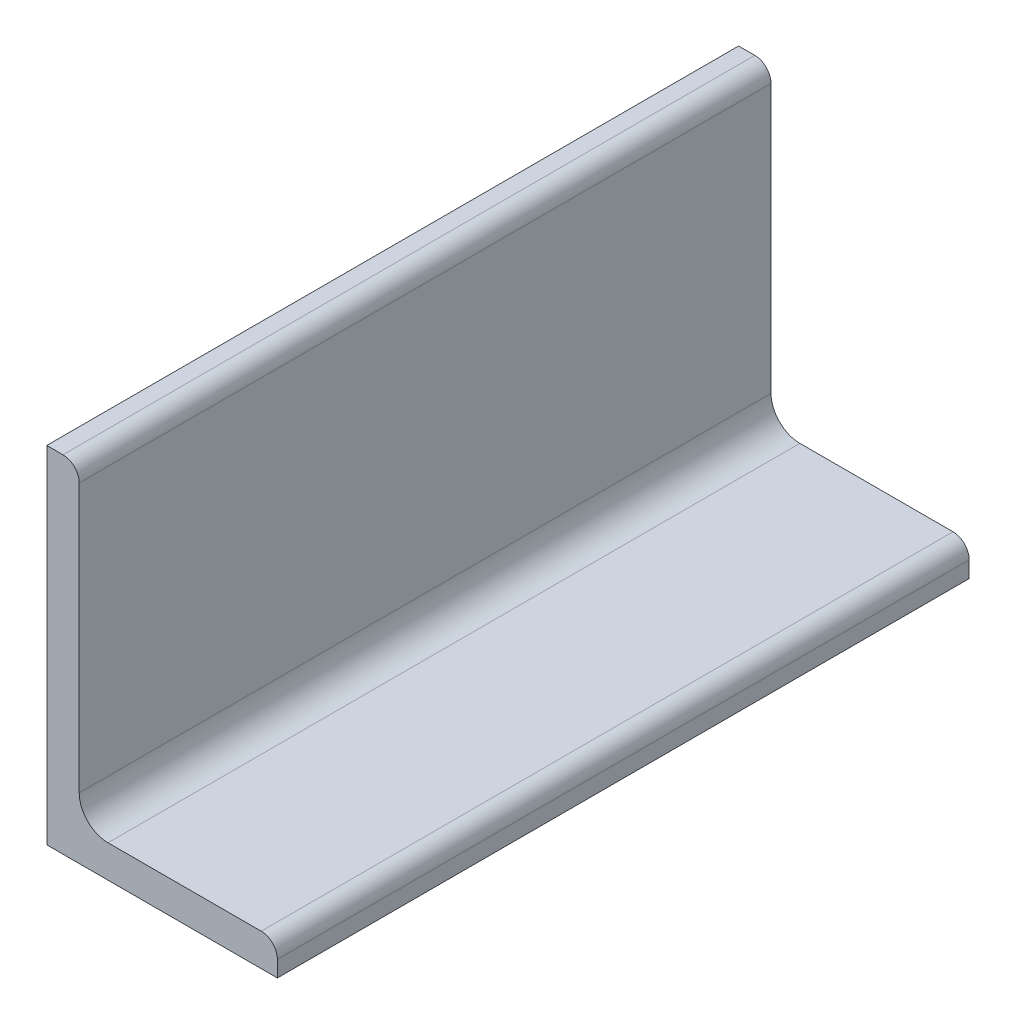
ISO-10303-21;
HEADER;
FILE_DESCRIPTION(('STEP AP214'),'2;1');
FILE_NAME('part.step','',(''),(''),'','','');
FILE_SCHEMA(('AUTOMOTIVE_DESIGN { 1 0 10303 214 1 1 1 1 }'));
ENDSEC;
DATA;
#1=APPLICATION_CONTEXT('core data for automotive mechanical design processes');
#2=APPLICATION_PROTOCOL_DEFINITION('international standard','automotive_design',2000,#1);
#3=PRODUCT_CONTEXT('',#1,'mechanical');
#4=PRODUCT('Part','Part','',(#3));
#5=PRODUCT_RELATED_PRODUCT_CATEGORY('part','',(#4));
#6=PRODUCT_DEFINITION_FORMATION('','',#4);
#7=PRODUCT_DEFINITION_CONTEXT('part definition',#1,'design');
#8=PRODUCT_DEFINITION('design','',#6,#7);
#9=PRODUCT_DEFINITION_SHAPE('','',#8);
#10=(LENGTH_UNIT() NAMED_UNIT(*) SI_UNIT(.MILLI.,.METRE.));
#11=(NAMED_UNIT(*) PLANE_ANGLE_UNIT() SI_UNIT($,.RADIAN.));
#12=(NAMED_UNIT(*) SI_UNIT($,.STERADIAN.) SOLID_ANGLE_UNIT());
#13=UNCERTAINTY_MEASURE_WITH_UNIT(LENGTH_MEASURE(1.E-05),#10,'distance_accuracy_value','');
#14=(GEOMETRIC_REPRESENTATION_CONTEXT(3) GLOBAL_UNCERTAINTY_ASSIGNED_CONTEXT((#13)) GLOBAL_UNIT_ASSIGNED_CONTEXT((#10,
#11,#12)) REPRESENTATION_CONTEXT('',''));
#15=CARTESIAN_POINT('',(0.,0.,0.));
#16=DIRECTION('',(0.,0.,1.));
#17=DIRECTION('',(1.,0.,0.));
#18=AXIS2_PLACEMENT_3D('',#15,#16,#17);
#19=CARTESIAN_POINT('',(0.865045893659089,152.925428131371,304.8));
#20=DIRECTION('',(1.,0.,0.));
#21=DIRECTION('',(0.,0.,-1.));
#22=AXIS2_PLACEMENT_3D('',#19,#20,#21);
#23=PLANE('',#22);
#24=DIRECTION('',(0.,-1.,0.));
#25=VECTOR('',#24,1.);
#26=CARTESIAN_POINT('',(0.865045893659089,152.925428131371,0.));
#27=LINE('',#26,#25);
#28=CARTESIAN_POINT('',(0.865045893659089,152.925428131371,0.));
#29=VERTEX_POINT('',#28);
#30=CARTESIAN_POINT('',(0.865045893659089,0.525428131371291,0.));
#31=VERTEX_POINT('',#30);
#32=EDGE_CURVE('E135',#29,#31,#27,.T.);
#33=ORIENTED_EDGE('',*,*,#32,.T.);
#34=DIRECTION('',(0.,0.,-1.));
#35=VECTOR('',#34,1.);
#36=CARTESIAN_POINT('',(0.865045893659089,0.525428131371291,304.8));
#37=LINE('',#36,#35);
#38=CARTESIAN_POINT('',(0.865045893659089,0.525428131371291,304.8));
#39=VERTEX_POINT('',#38);
#40=EDGE_CURVE('E11',#39,#31,#37,.T.);
#41=ORIENTED_EDGE('',*,*,#40,.F.);
#42=DIRECTION('',(0.,-1.,0.));
#43=VECTOR('',#42,1.);
#44=CARTESIAN_POINT('',(0.865045893659089,152.925428131371,304.8));
#45=LINE('',#44,#43);
#46=CARTESIAN_POINT('',(0.865045893659089,152.925428131371,304.8));
#47=VERTEX_POINT('',#46);
#48=EDGE_CURVE('E151',#47,#39,#45,.T.);
#49=ORIENTED_EDGE('',*,*,#48,.F.);
#50=DIRECTION('',(0.,0.,-1.));
#51=VECTOR('',#50,1.);
#52=CARTESIAN_POINT('',(0.865045893659089,152.925428131371,304.8));
#53=LINE('',#52,#51);
#54=EDGE_CURVE('E131',#47,#29,#53,.T.);
#55=ORIENTED_EDGE('',*,*,#54,.T.);
#56=EDGE_LOOP('',(#33,#41,#49,#55));
#57=FACE_BOUND('',#56,.T.);
#58=ADVANCED_FACE('F33',(#57),#23,.F.);
#59=CARTESIAN_POINT('',(0.865045893659089,0.525428131371291,304.8));
#60=DIRECTION('',(0.,1.,0.));
#61=DIRECTION('',(0.,0.,1.));
#62=AXIS2_PLACEMENT_3D('',#59,#60,#61);
#63=PLANE('',#62);
#64=DIRECTION('',(1.,0.,0.));
#65=VECTOR('',#64,1.);
#66=CARTESIAN_POINT('',(0.865045893659089,0.525428131371291,0.));
#67=LINE('',#66,#65);
#68=CARTESIAN_POINT('',(102.465045893659,0.525428131371291,0.));
#69=VERTEX_POINT('',#68);
#70=EDGE_CURVE('E138',#31,#69,#67,.T.);
#71=ORIENTED_EDGE('',*,*,#70,.T.);
#72=DIRECTION('',(0.,0.,-1.));
#73=VECTOR('',#72,1.);
#74=CARTESIAN_POINT('',(102.465045893659,0.525428131371291,304.8));
#75=LINE('',#74,#73);
#76=CARTESIAN_POINT('',(102.465045893659,0.525428131371291,304.8));
#77=VERTEX_POINT('',#76);
#78=EDGE_CURVE('E41',#77,#69,#75,.T.);
#79=ORIENTED_EDGE('',*,*,#78,.F.);
#80=DIRECTION('',(1.,0.,0.));
#81=VECTOR('',#80,1.);
#82=CARTESIAN_POINT('',(0.865045893659089,0.525428131371291,304.8));
#83=LINE('',#82,#81);
#84=EDGE_CURVE('E95',#39,#77,#83,.T.);
#85=ORIENTED_EDGE('',*,*,#84,.F.);
#86=ORIENTED_EDGE('',*,*,#40,.T.);
#87=EDGE_LOOP('',(#71,#79,#85,#86));
#88=FACE_BOUND('',#87,.T.);
#89=ADVANCED_FACE('F194',(#88),#63,.F.);
#90=CARTESIAN_POINT('',(102.465045893659,0.525428131371291,304.8));
#91=DIRECTION('',(-1.,0.,0.));
#92=DIRECTION('',(0.,0.,1.));
#93=AXIS2_PLACEMENT_3D('',#90,#91,#92);
#94=PLANE('',#93);
#95=DIRECTION('',(0.,1.,0.));
#96=VECTOR('',#95,1.);
#97=CARTESIAN_POINT('',(102.465045893659,0.525428131371291,0.));
#98=LINE('',#97,#96);
#99=CARTESIAN_POINT('',(102.465045893659,7.66917813137129,0.));
#100=VERTEX_POINT('',#99);
#101=EDGE_CURVE('E140',#69,#100,#98,.T.);
#102=ORIENTED_EDGE('',*,*,#101,.T.);
#103=DIRECTION('',(0.,0.,-1.));
#104=VECTOR('',#103,1.);
#105=CARTESIAN_POINT('',(102.465045893659,7.66917813137129,304.8));
#106=LINE('',#105,#104);
#107=CARTESIAN_POINT('',(102.465045893659,7.66917813137129,304.8));
#108=VERTEX_POINT('',#107);
#109=EDGE_CURVE('E161',#108,#100,#106,.T.);
#110=ORIENTED_EDGE('',*,*,#109,.F.);
#111=DIRECTION('',(0.,1.,0.));
#112=VECTOR('',#111,1.);
#113=CARTESIAN_POINT('',(102.465045893659,0.525428131371291,304.8));
#114=LINE('',#113,#112);
#115=EDGE_CURVE('E169',#77,#108,#114,.T.);
#116=ORIENTED_EDGE('',*,*,#115,.F.);
#117=ORIENTED_EDGE('',*,*,#78,.T.);
#118=EDGE_LOOP('',(#102,#110,#116,#117));
#119=FACE_BOUND('',#118,.T.);
#120=ADVANCED_FACE('F167',(#119),#94,.F.);
#121=CARTESIAN_POINT('',(95.3212958936591,7.66917813137129,304.8));
#122=DIRECTION('',(0.,0.,-1.));
#123=DIRECTION('',(-1.,0.,0.));
#124=AXIS2_PLACEMENT_3D('',#121,#122,#123);
#125=CYLINDRICAL_SURFACE('',#124,7.14375000000001);
#126=CARTESIAN_POINT('',(95.3212958936591,7.66917813137129,0.));
#127=DIRECTION('',(0.,0.,1.));
#128=DIRECTION('',(1.,0.,0.));
#129=AXIS2_PLACEMENT_3D('',#126,#127,#128);
#130=CIRCLE('',#129,7.14375000000001);
#131=CARTESIAN_POINT('',(95.3212958936591,14.8129281313713,0.));
#132=VERTEX_POINT('',#131);
#133=EDGE_CURVE('E142',#100,#132,#130,.T.);
#134=ORIENTED_EDGE('',*,*,#133,.T.);
#135=DIRECTION('',(0.,0.,-1.));
#136=VECTOR('',#135,1.);
#137=CARTESIAN_POINT('',(95.3212958936591,14.8129281313713,304.8));
#138=LINE('',#137,#136);
#139=CARTESIAN_POINT('',(95.3212958936591,14.8129281313713,304.8));
#140=VERTEX_POINT('',#139);
#141=EDGE_CURVE('E158',#140,#132,#138,.T.);
#142=ORIENTED_EDGE('',*,*,#141,.F.);
#143=CARTESIAN_POINT('',(95.3212958936591,7.66917813137129,304.8));
#144=DIRECTION('',(0.,0.,1.));
#145=DIRECTION('',(1.,0.,0.));
#146=AXIS2_PLACEMENT_3D('',#143,#144,#145);
#147=CIRCLE('',#146,7.14375000000001);
#148=EDGE_CURVE('E185',#108,#140,#147,.T.);
#149=ORIENTED_EDGE('',*,*,#148,.F.);
#150=ORIENTED_EDGE('',*,*,#109,.T.);
#151=EDGE_LOOP('',(#134,#142,#149,#150));
#152=FACE_BOUND('',#151,.T.);
#153=ADVANCED_FACE('F178',(#152),#125,.T.);
#154=CARTESIAN_POINT('',(95.3212958936591,14.8129281313713,304.8));
#155=DIRECTION('',(0.,-1.,0.));
#156=DIRECTION('',(0.,0.,-1.));
#157=AXIS2_PLACEMENT_3D('',#154,#155,#156);
#158=PLANE('',#157);
#159=DIRECTION('',(-1.,0.,0.));
#160=VECTOR('',#159,1.);
#161=CARTESIAN_POINT('',(95.3212958936591,14.8129281313713,0.));
#162=LINE('',#161,#160);
#163=CARTESIAN_POINT('',(27.8525458936591,14.8129281313713,0.));
#164=VERTEX_POINT('',#163);
#165=EDGE_CURVE('E144',#132,#164,#162,.T.);
#166=ORIENTED_EDGE('',*,*,#165,.T.);
#167=DIRECTION('',(0.,0.,-1.));
#168=VECTOR('',#167,1.);
#169=CARTESIAN_POINT('',(27.8525458936591,14.8129281313713,304.8));
#170=LINE('',#169,#168);
#171=CARTESIAN_POINT('',(27.8525458936591,14.8129281313713,304.8));
#172=VERTEX_POINT('',#171);
#173=EDGE_CURVE('E155',#172,#164,#170,.T.);
#174=ORIENTED_EDGE('',*,*,#173,.F.);
#175=DIRECTION('',(-1.,0.,0.));
#176=VECTOR('',#175,1.);
#177=CARTESIAN_POINT('',(95.3212958936591,14.8129281313713,304.8));
#178=LINE('',#177,#176);
#179=EDGE_CURVE('E184',#140,#172,#178,.T.);
#180=ORIENTED_EDGE('',*,*,#179,.F.);
#181=ORIENTED_EDGE('',*,*,#141,.T.);
#182=EDGE_LOOP('',(#166,#174,#180,#181));
#183=FACE_BOUND('',#182,.T.);
#184=ADVANCED_FACE('F182',(#183),#158,.F.);
#185=CARTESIAN_POINT('',(27.8525458936591,27.5129281313713,304.8));
#186=DIRECTION('',(0.,0.,-1.));
#187=DIRECTION('',(-1.,0.,0.));
#188=AXIS2_PLACEMENT_3D('',#185,#186,#187);
#189=CYLINDRICAL_SURFACE('',#188,12.7);
#190=CARTESIAN_POINT('',(27.8525458936591,27.5129281313713,0.));
#191=DIRECTION('',(0.,0.,-1.));
#192=DIRECTION('',(1.,0.,0.));
#193=AXIS2_PLACEMENT_3D('',#190,#191,#192);
#194=CIRCLE('',#193,12.7);
#195=CARTESIAN_POINT('',(15.1525458936591,27.5129281313713,0.));
#196=VERTEX_POINT('',#195);
#197=EDGE_CURVE('E146',#164,#196,#194,.T.);
#198=ORIENTED_EDGE('',*,*,#197,.T.);
#199=DIRECTION('',(0.,0.,-1.));
#200=VECTOR('',#199,1.);
#201=CARTESIAN_POINT('',(15.1525458936591,27.5129281313713,304.8));
#202=LINE('',#201,#200);
#203=CARTESIAN_POINT('',(15.1525458936591,27.5129281313713,304.8));
#204=VERTEX_POINT('',#203);
#205=EDGE_CURVE('E126',#204,#196,#202,.T.);
#206=ORIENTED_EDGE('',*,*,#205,.F.);
#207=CARTESIAN_POINT('',(27.8525458936591,27.5129281313713,304.8));
#208=DIRECTION('',(0.,0.,-1.));
#209=DIRECTION('',(1.,0.,0.));
#210=AXIS2_PLACEMENT_3D('',#207,#208,#209);
#211=CIRCLE('',#210,12.7);
#212=EDGE_CURVE('E117',#172,#204,#211,.T.);
#213=ORIENTED_EDGE('',*,*,#212,.F.);
#214=ORIENTED_EDGE('',*,*,#173,.T.);
#215=EDGE_LOOP('',(#198,#206,#213,#214));
#216=FACE_BOUND('',#215,.T.);
#217=ADVANCED_FACE('F206',(#216),#189,.F.);
#218=CARTESIAN_POINT('',(15.1525458936591,27.5129281313713,304.8));
#219=DIRECTION('',(-1.,0.,0.));
#220=DIRECTION('',(0.,0.,1.));
#221=AXIS2_PLACEMENT_3D('',#218,#219,#220);
#222=PLANE('',#221);
#223=DIRECTION('',(0.,1.,0.));
#224=VECTOR('',#223,1.);
#225=CARTESIAN_POINT('',(15.1525458936591,27.5129281313713,0.));
#226=LINE('',#225,#224);
#227=CARTESIAN_POINT('',(15.1525458936591,145.781678131371,0.));
#228=VERTEX_POINT('',#227);
#229=EDGE_CURVE('E125',#196,#228,#226,.T.);
#230=ORIENTED_EDGE('',*,*,#229,.T.);
#231=DIRECTION('',(0.,0.,-1.));
#232=VECTOR('',#231,1.);
#233=CARTESIAN_POINT('',(15.1525458936591,145.781678131371,304.8));
#234=LINE('',#233,#232);
#235=CARTESIAN_POINT('',(15.1525458936591,145.781678131371,304.8));
#236=VERTEX_POINT('',#235);
#237=EDGE_CURVE('E122',#236,#228,#234,.T.);
#238=ORIENTED_EDGE('',*,*,#237,.F.);
#239=DIRECTION('',(0.,1.,0.));
#240=VECTOR('',#239,1.);
#241=CARTESIAN_POINT('',(15.1525458936591,27.5129281313713,304.8));
#242=LINE('',#241,#240);
#243=EDGE_CURVE('E111',#204,#236,#242,.T.);
#244=ORIENTED_EDGE('',*,*,#243,.F.);
#245=ORIENTED_EDGE('',*,*,#205,.T.);
#246=EDGE_LOOP('',(#230,#238,#244,#245));
#247=FACE_BOUND('',#246,.T.);
#248=ADVANCED_FACE('F123',(#247),#222,.F.);
#249=CARTESIAN_POINT('',(8.00879589365909,145.781678131371,304.8));
#250=DIRECTION('',(0.,0.,-1.));
#251=DIRECTION('',(-1.,0.,0.));
#252=AXIS2_PLACEMENT_3D('',#249,#250,#251);
#253=CYLINDRICAL_SURFACE('',#252,7.14375);
#254=CARTESIAN_POINT('',(8.00879589365909,145.781678131371,0.));
#255=DIRECTION('',(0.,0.,1.));
#256=DIRECTION('',(1.,0.,0.));
#257=AXIS2_PLACEMENT_3D('',#254,#255,#256);
#258=CIRCLE('',#257,7.14375);
#259=CARTESIAN_POINT('',(8.00879589365909,152.925428131371,0.));
#260=VERTEX_POINT('',#259);
#261=EDGE_CURVE('E81',#228,#260,#258,.T.);
#262=ORIENTED_EDGE('',*,*,#261,.T.);
#263=DIRECTION('',(0.,0.,-1.));
#264=VECTOR('',#263,1.);
#265=CARTESIAN_POINT('',(8.00879589365909,152.925428131371,304.8));
#266=LINE('',#265,#264);
#267=CARTESIAN_POINT('',(8.00879589365909,152.925428131371,304.8));
#268=VERTEX_POINT('',#267);
#269=EDGE_CURVE('E127',#268,#260,#266,.T.);
#270=ORIENTED_EDGE('',*,*,#269,.F.);
#271=CARTESIAN_POINT('',(8.00879589365909,145.781678131371,304.8));
#272=DIRECTION('',(0.,0.,1.));
#273=DIRECTION('',(1.,0.,0.));
#274=AXIS2_PLACEMENT_3D('',#271,#272,#273);
#275=CIRCLE('',#274,7.14375);
#276=EDGE_CURVE('E115',#236,#268,#275,.T.);
#277=ORIENTED_EDGE('',*,*,#276,.F.);
#278=ORIENTED_EDGE('',*,*,#237,.T.);
#279=EDGE_LOOP('',(#262,#270,#277,#278));
#280=FACE_BOUND('',#279,.T.);
#281=ADVANCED_FACE('F129',(#280),#253,.T.);
#282=CARTESIAN_POINT('',(8.00879589365909,152.925428131371,304.8));
#283=DIRECTION('',(0.,-1.,0.));
#284=DIRECTION('',(0.,0.,-1.));
#285=AXIS2_PLACEMENT_3D('',#282,#283,#284);
#286=PLANE('',#285);
#287=DIRECTION('',(-1.,0.,0.));
#288=VECTOR('',#287,1.);
#289=CARTESIAN_POINT('',(8.00879589365909,152.925428131371,0.));
#290=LINE('',#289,#288);
#291=EDGE_CURVE('E87',#260,#29,#290,.T.);
#292=ORIENTED_EDGE('',*,*,#291,.T.);
#293=ORIENTED_EDGE('',*,*,#54,.F.);
#294=DIRECTION('',(-1.,0.,0.));
#295=VECTOR('',#294,1.);
#296=CARTESIAN_POINT('',(8.00879589365909,152.925428131371,304.8));
#297=LINE('',#296,#295);
#298=EDGE_CURVE('E49',#268,#47,#297,.T.);
#299=ORIENTED_EDGE('',*,*,#298,.F.);
#300=ORIENTED_EDGE('',*,*,#269,.T.);
#301=EDGE_LOOP('',(#292,#293,#299,#300));
#302=FACE_BOUND('',#301,.T.);
#303=ADVANCED_FACE('F214',(#302),#286,.F.);
#304=CARTESIAN_POINT('',(95.3212958936591,7.66917813137129,304.8));
#305=DIRECTION('',(0.,0.,1.));
#306=DIRECTION('',(1.,0.,0.));
#307=AXIS2_PLACEMENT_3D('',#304,#305,#306);
#308=PLANE('',#307);
#309=ORIENTED_EDGE('',*,*,#48,.T.);
#310=ORIENTED_EDGE('',*,*,#84,.T.);
#311=ORIENTED_EDGE('',*,*,#115,.T.);
#312=ORIENTED_EDGE('',*,*,#148,.T.);
#313=ORIENTED_EDGE('',*,*,#179,.T.);
#314=ORIENTED_EDGE('',*,*,#212,.T.);
#315=ORIENTED_EDGE('',*,*,#243,.T.);
#316=ORIENTED_EDGE('',*,*,#276,.T.);
#317=ORIENTED_EDGE('',*,*,#298,.T.);
#318=EDGE_LOOP('',(#309,#310,#311,#312,#313,#314,#315,#316,#317));
#319=FACE_BOUND('',#318,.T.);
#320=ADVANCED_FACE('F113',(#319),#308,.T.);
#321=CARTESIAN_POINT('',(95.3212958936591,7.66917813137129,0.));
#322=DIRECTION('',(0.,0.,1.));
#323=DIRECTION('',(1.,0.,0.));
#324=AXIS2_PLACEMENT_3D('',#321,#322,#323);
#325=PLANE('',#324);
#326=ORIENTED_EDGE('',*,*,#32,.F.);
#327=ORIENTED_EDGE('',*,*,#291,.F.);
#328=ORIENTED_EDGE('',*,*,#261,.F.);
#329=ORIENTED_EDGE('',*,*,#229,.F.);
#330=ORIENTED_EDGE('',*,*,#197,.F.);
#331=ORIENTED_EDGE('',*,*,#165,.F.);
#332=ORIENTED_EDGE('',*,*,#133,.F.);
#333=ORIENTED_EDGE('',*,*,#101,.F.);
#334=ORIENTED_EDGE('',*,*,#70,.F.);
#335=EDGE_LOOP('',(#326,#327,#328,#329,#330,#331,#332,#333,#334));
#336=FACE_BOUND('',#335,.T.);
#337=ADVANCED_FACE('F173',(#336),#325,.F.);
#338=CLOSED_SHELL('',(#58,#89,#120,#153,#184,#217,#248,#281,#303,#320,#337));
#339=MANIFOLD_SOLID_BREP('B2',#338);
#340=ADVANCED_BREP_SHAPE_REPRESENTATION('',(#18,#339),#14);
#341=SHAPE_DEFINITION_REPRESENTATION(#9,#340);
ENDSEC;
END-ISO-10303-21;
